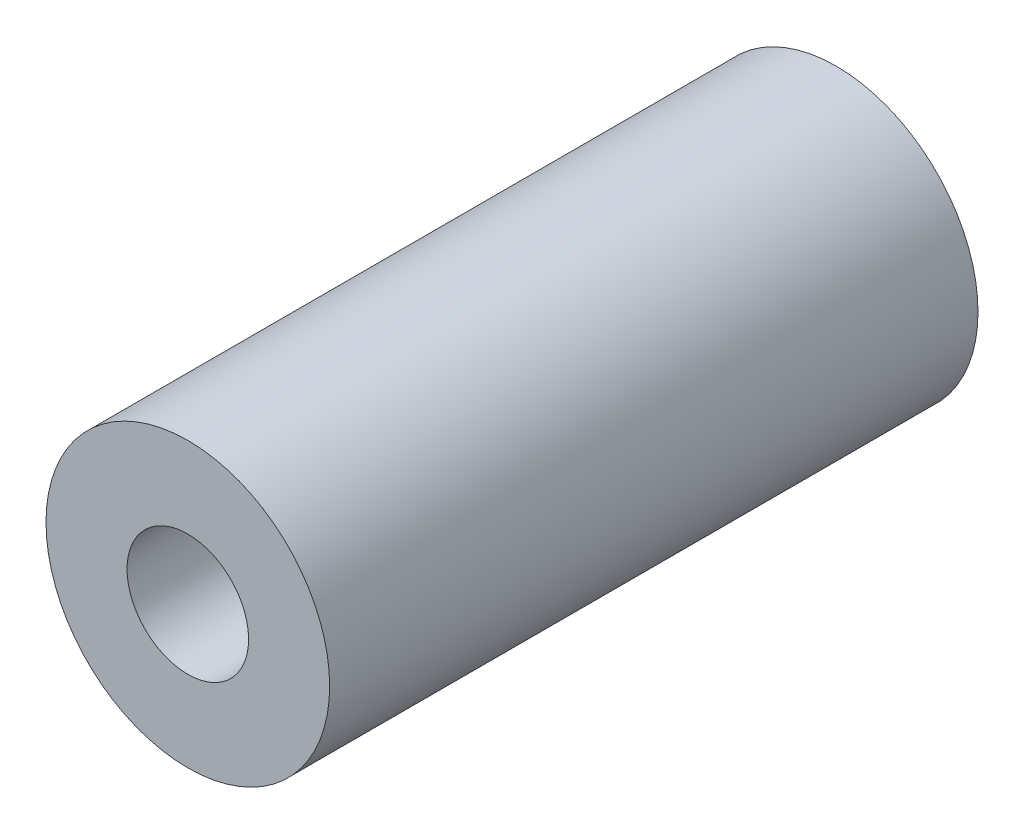
ISO-10303-21;
HEADER;
FILE_DESCRIPTION(('STEP AP214'),'2;1');
FILE_NAME('part.step','',(''),(''),'','','');
FILE_SCHEMA(('AUTOMOTIVE_DESIGN { 1 0 10303 214 1 1 1 1 }'));
ENDSEC;
DATA;
#1=APPLICATION_CONTEXT('core data for automotive mechanical design processes');
#2=APPLICATION_PROTOCOL_DEFINITION('international standard','automotive_design',2000,#1);
#3=PRODUCT_CONTEXT('',#1,'mechanical');
#4=PRODUCT('Part','Part','',(#3));
#5=PRODUCT_RELATED_PRODUCT_CATEGORY('part','',(#4));
#6=PRODUCT_DEFINITION_FORMATION('','',#4);
#7=PRODUCT_DEFINITION_CONTEXT('part definition',#1,'design');
#8=PRODUCT_DEFINITION('design','',#6,#7);
#9=PRODUCT_DEFINITION_SHAPE('','',#8);
#10=(LENGTH_UNIT() NAMED_UNIT(*) SI_UNIT(.MILLI.,.METRE.));
#11=(NAMED_UNIT(*) PLANE_ANGLE_UNIT() SI_UNIT($,.RADIAN.));
#12=(NAMED_UNIT(*) SI_UNIT($,.STERADIAN.) SOLID_ANGLE_UNIT());
#13=UNCERTAINTY_MEASURE_WITH_UNIT(LENGTH_MEASURE(1.E-05),#10,'distance_accuracy_value','');
#14=(GEOMETRIC_REPRESENTATION_CONTEXT(3) GLOBAL_UNCERTAINTY_ASSIGNED_CONTEXT((#13)) GLOBAL_UNIT_ASSIGNED_CONTEXT((#10,
#11,#12)) REPRESENTATION_CONTEXT('',''));
#15=CARTESIAN_POINT('',(0.,0.,0.));
#16=DIRECTION('',(0.,0.,1.));
#17=DIRECTION('',(1.,0.,0.));
#18=AXIS2_PLACEMENT_3D('',#15,#16,#17);
#19=CARTESIAN_POINT('',(0.,0.,16.));
#20=DIRECTION('',(0.,0.,1.));
#21=DIRECTION('',(1.,0.,0.));
#22=AXIS2_PLACEMENT_3D('',#19,#20,#21);
#23=PLANE('',#22);
#24=CARTESIAN_POINT('',(0.,0.,16.));
#25=DIRECTION('',(0.,0.,1.));
#26=DIRECTION('',(1.,0.,0.));
#27=AXIS2_PLACEMENT_3D('',#24,#25,#26);
#28=CIRCLE('',#27,3.5);
#29=CARTESIAN_POINT('',(3.5,0.,16.));
#30=VERTEX_POINT('',#29);
#31=EDGE_CURVE('E10',#30,#30,#28,.T.);
#32=ORIENTED_EDGE('',*,*,#31,.T.);
#33=EDGE_LOOP('',(#32));
#34=FACE_BOUND('',#33,.T.);
#35=CARTESIAN_POINT('',(0.,0.,16.));
#36=DIRECTION('',(0.,0.,1.));
#37=DIRECTION('',(1.,0.,0.));
#38=AXIS2_PLACEMENT_3D('',#35,#36,#37);
#39=CIRCLE('',#38,1.5);
#40=CARTESIAN_POINT('',(1.5,0.,16.));
#41=VERTEX_POINT('',#40);
#42=EDGE_CURVE('E35',#41,#41,#39,.T.);
#43=ORIENTED_EDGE('',*,*,#42,.F.);
#44=EDGE_LOOP('',(#43));
#45=FACE_BOUND('',#44,.T.);
#46=ADVANCED_FACE('F24',(#34,#45),#23,.T.);
#47=CARTESIAN_POINT('',(0.,0.,0.));
#48=DIRECTION('',(0.,0.,1.));
#49=DIRECTION('',(1.,0.,0.));
#50=AXIS2_PLACEMENT_3D('',#47,#48,#49);
#51=PLANE('',#50);
#52=CARTESIAN_POINT('',(0.,0.,0.));
#53=DIRECTION('',(0.,0.,1.));
#54=DIRECTION('',(1.,0.,0.));
#55=AXIS2_PLACEMENT_3D('',#52,#53,#54);
#56=CIRCLE('',#55,3.5);
#57=CARTESIAN_POINT('',(3.5,0.,0.));
#58=VERTEX_POINT('',#57);
#59=EDGE_CURVE('E31',#58,#58,#56,.T.);
#60=ORIENTED_EDGE('',*,*,#59,.F.);
#61=EDGE_LOOP('',(#60));
#62=FACE_BOUND('',#61,.T.);
#63=CARTESIAN_POINT('',(0.,0.,0.));
#64=DIRECTION('',(0.,0.,1.));
#65=DIRECTION('',(1.,0.,0.));
#66=AXIS2_PLACEMENT_3D('',#63,#64,#65);
#67=CIRCLE('',#66,1.5);
#68=CARTESIAN_POINT('',(1.5,0.,0.));
#69=VERTEX_POINT('',#68);
#70=EDGE_CURVE('E39',#69,#69,#67,.T.);
#71=ORIENTED_EDGE('',*,*,#70,.T.);
#72=EDGE_LOOP('',(#71));
#73=FACE_BOUND('',#72,.T.);
#74=ADVANCED_FACE('F45',(#62,#73),#51,.F.);
#75=CARTESIAN_POINT('',(0.,0.,16.));
#76=DIRECTION('',(0.,0.,-1.));
#77=DIRECTION('',(-1.,0.,0.));
#78=AXIS2_PLACEMENT_3D('',#75,#76,#77);
#79=CYLINDRICAL_SURFACE('',#78,3.5);
#80=ORIENTED_EDGE('',*,*,#31,.F.);
#81=EDGE_LOOP('',(#80));
#82=FACE_BOUND('',#81,.T.);
#83=ORIENTED_EDGE('',*,*,#59,.T.);
#84=EDGE_LOOP('',(#83));
#85=FACE_BOUND('',#84,.T.);
#86=ADVANCED_FACE('F26',(#82,#85),#79,.T.);
#87=CARTESIAN_POINT('',(0.,0.,16.));
#88=DIRECTION('',(0.,0.,-1.));
#89=DIRECTION('',(-1.,0.,0.));
#90=AXIS2_PLACEMENT_3D('',#87,#88,#89);
#91=CYLINDRICAL_SURFACE('',#90,1.5);
#92=ORIENTED_EDGE('',*,*,#42,.T.);
#93=EDGE_LOOP('',(#92));
#94=FACE_BOUND('',#93,.T.);
#95=ORIENTED_EDGE('',*,*,#70,.F.);
#96=EDGE_LOOP('',(#95));
#97=FACE_BOUND('',#96,.T.);
#98=ADVANCED_FACE('F47',(#94,#97),#91,.F.);
#99=CLOSED_SHELL('',(#46,#74,#86,#98));
#100=MANIFOLD_SOLID_BREP('B2',#99);
#101=ADVANCED_BREP_SHAPE_REPRESENTATION('',(#18,#100),#14);
#102=SHAPE_DEFINITION_REPRESENTATION(#9,#101);
ENDSEC;
END-ISO-10303-21;
